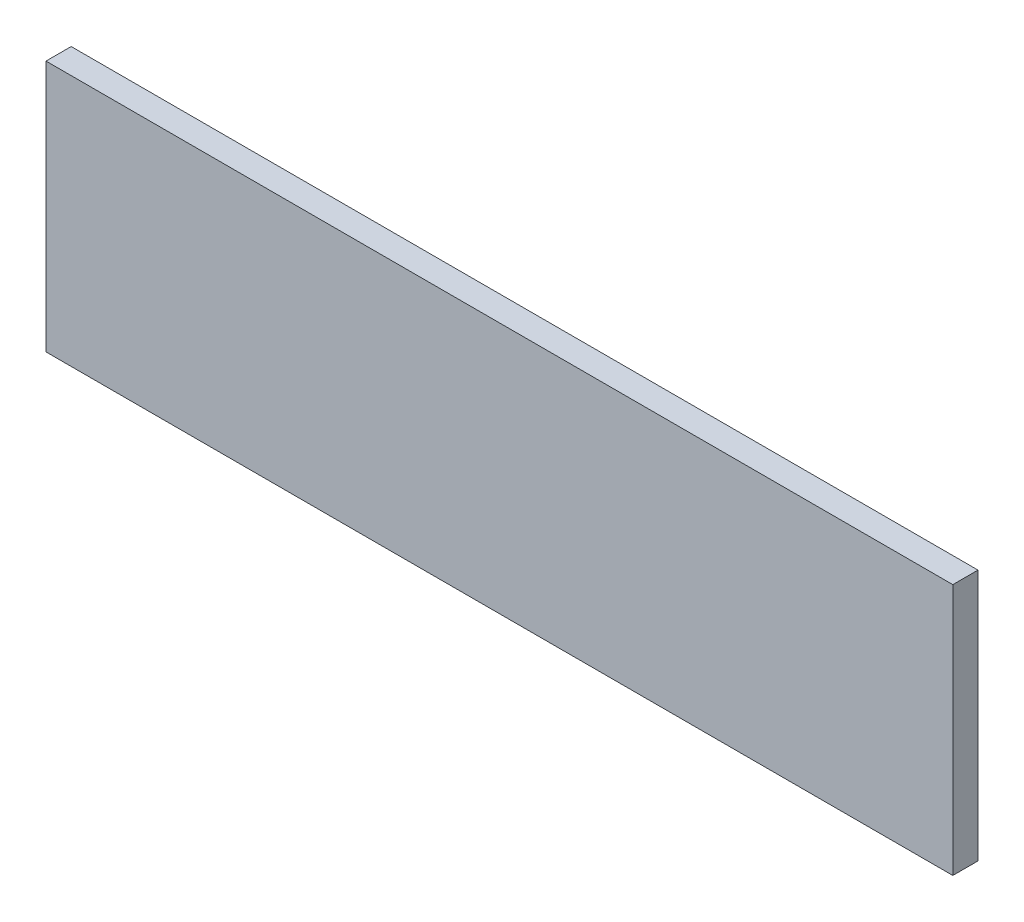
ISO-10303-21;
HEADER;
FILE_DESCRIPTION(('STEP AP214'),'2;1');
FILE_NAME('part.step','',(''),(''),'','','');
FILE_SCHEMA(('AUTOMOTIVE_DESIGN { 1 0 10303 214 1 1 1 1 }'));
ENDSEC;
DATA;
#1=APPLICATION_CONTEXT('core data for automotive mechanical design processes');
#2=APPLICATION_PROTOCOL_DEFINITION('international standard','automotive_design',2000,#1);
#3=PRODUCT_CONTEXT('',#1,'mechanical');
#4=PRODUCT('Part','Part','',(#3));
#5=PRODUCT_RELATED_PRODUCT_CATEGORY('part','',(#4));
#6=PRODUCT_DEFINITION_FORMATION('','',#4);
#7=PRODUCT_DEFINITION_CONTEXT('part definition',#1,'design');
#8=PRODUCT_DEFINITION('design','',#6,#7);
#9=PRODUCT_DEFINITION_SHAPE('','',#8);
#10=(LENGTH_UNIT() NAMED_UNIT(*) SI_UNIT(.MILLI.,.METRE.));
#11=(NAMED_UNIT(*) PLANE_ANGLE_UNIT() SI_UNIT($,.RADIAN.));
#12=(NAMED_UNIT(*) SI_UNIT($,.STERADIAN.) SOLID_ANGLE_UNIT());
#13=UNCERTAINTY_MEASURE_WITH_UNIT(LENGTH_MEASURE(1.E-05),#10,'distance_accuracy_value','');
#14=(GEOMETRIC_REPRESENTATION_CONTEXT(3) GLOBAL_UNCERTAINTY_ASSIGNED_CONTEXT((#13)) GLOBAL_UNIT_ASSIGNED_CONTEXT((#10,
#11,#12)) REPRESENTATION_CONTEXT('',''));
#15=CARTESIAN_POINT('',(0.,0.,0.));
#16=DIRECTION('',(0.,0.,1.));
#17=DIRECTION('',(1.,0.,0.));
#18=AXIS2_PLACEMENT_3D('',#15,#16,#17);
#19=CARTESIAN_POINT('',(-3.013229038242,-0.275,0.361799999973));
#20=DIRECTION('',(0.,0.,1.));
#21=DIRECTION('',(1.,0.,0.));
#22=AXIS2_PLACEMENT_3D('',#19,#20,#21);
#23=PLANE('',#22);
#24=DIRECTION('',(1.,0.,0.));
#25=VECTOR('',#24,1.);
#26=CARTESIAN_POINT('',(-3.013229038242,-0.275,0.361799999973));
#27=LINE('',#26,#25);
#28=CARTESIAN_POINT('',(-3.013229038242,-0.275,0.361799999973));
#29=VERTEX_POINT('',#28);
#30=CARTESIAN_POINT('',(0.586770961758,-0.275,0.361799999973));
#31=VERTEX_POINT('',#30);
#32=EDGE_CURVE('E42',#29,#31,#27,.T.);
#33=ORIENTED_EDGE('',*,*,#32,.T.);
#34=DIRECTION('',(0.,1.,0.));
#35=VECTOR('',#34,1.);
#36=CARTESIAN_POINT('',(0.586770961758,-0.275,0.361799999973));
#37=LINE('',#36,#35);
#38=CARTESIAN_POINT('',(0.586770961758,0.725,0.361799999973));
#39=VERTEX_POINT('',#38);
#40=EDGE_CURVE('E75',#31,#39,#37,.T.);
#41=ORIENTED_EDGE('',*,*,#40,.T.);
#42=DIRECTION('',(-1.,0.,0.));
#43=VECTOR('',#42,1.);
#44=CARTESIAN_POINT('',(0.586770961758,0.725,0.361799999973));
#45=LINE('',#44,#43);
#46=CARTESIAN_POINT('',(-3.013229038242,0.725,0.361799999973));
#47=VERTEX_POINT('',#46);
#48=EDGE_CURVE('E103',#39,#47,#45,.T.);
#49=ORIENTED_EDGE('',*,*,#48,.T.);
#50=DIRECTION('',(0.,-1.,0.));
#51=VECTOR('',#50,1.);
#52=CARTESIAN_POINT('',(-3.013229038242,0.725,0.361799999973));
#53=LINE('',#52,#51);
#54=EDGE_CURVE('E11',#47,#29,#53,.T.);
#55=ORIENTED_EDGE('',*,*,#54,.T.);
#56=EDGE_LOOP('',(#33,#41,#49,#55));
#57=FACE_BOUND('',#56,.T.);
#58=ADVANCED_FACE('F17',(#57),#23,.T.);
#59=CARTESIAN_POINT('',(-3.013229038242,0.725,0.361799999973));
#60=DIRECTION('',(1.,0.,0.));
#61=DIRECTION('',(0.,1.,0.));
#62=AXIS2_PLACEMENT_3D('',#59,#60,#61);
#63=PLANE('',#62);
#64=DIRECTION('',(0.,0.,1.));
#65=VECTOR('',#64,1.);
#66=CARTESIAN_POINT('',(-3.013229038242,-0.275,0.361799999973));
#67=LINE('',#66,#65);
#68=CARTESIAN_POINT('',(-3.013229038242,-0.275,0.261799999973));
#69=VERTEX_POINT('',#68);
#70=EDGE_CURVE('E25',#69,#29,#67,.T.);
#71=ORIENTED_EDGE('',*,*,#70,.T.);
#72=ORIENTED_EDGE('',*,*,#54,.F.);
#73=DIRECTION('',(0.,0.,-1.));
#74=VECTOR('',#73,1.);
#75=CARTESIAN_POINT('',(-3.013229038242,0.725,0.361799999973));
#76=LINE('',#75,#74);
#77=CARTESIAN_POINT('',(-3.013229038242,0.725,0.261799999973));
#78=VERTEX_POINT('',#77);
#79=EDGE_CURVE('E100',#47,#78,#76,.T.);
#80=ORIENTED_EDGE('',*,*,#79,.T.);
#81=DIRECTION('',(0.,-1.,0.));
#82=VECTOR('',#81,1.);
#83=CARTESIAN_POINT('',(-3.013229038242,-0.275,0.261799999973));
#84=LINE('',#83,#82);
#85=EDGE_CURVE('E86',#78,#69,#84,.T.);
#86=ORIENTED_EDGE('',*,*,#85,.T.);
#87=EDGE_LOOP('',(#71,#72,#80,#86));
#88=FACE_BOUND('',#87,.T.);
#89=ADVANCED_FACE('F115',(#88),#63,.F.);
#90=CARTESIAN_POINT('',(-3.013229038242,-0.275,0.361799999973));
#91=DIRECTION('',(0.,1.,0.));
#92=DIRECTION('',(1.,0.,0.));
#93=AXIS2_PLACEMENT_3D('',#90,#91,#92);
#94=PLANE('',#93);
#95=DIRECTION('',(0.,0.,1.));
#96=VECTOR('',#95,1.);
#97=CARTESIAN_POINT('',(0.586770961758,-0.275,0.361799999973));
#98=LINE('',#97,#96);
#99=CARTESIAN_POINT('',(0.586770961758,-0.275,0.261799999973));
#100=VERTEX_POINT('',#99);
#101=EDGE_CURVE('E69',#100,#31,#98,.T.);
#102=ORIENTED_EDGE('',*,*,#101,.T.);
#103=ORIENTED_EDGE('',*,*,#32,.F.);
#104=ORIENTED_EDGE('',*,*,#70,.F.);
#105=DIRECTION('',(1.,0.,0.));
#106=VECTOR('',#105,1.);
#107=CARTESIAN_POINT('',(-3.013229038242,-0.275,0.261799999973));
#108=LINE('',#107,#106);
#109=EDGE_CURVE('E80',#69,#100,#108,.T.);
#110=ORIENTED_EDGE('',*,*,#109,.T.);
#111=EDGE_LOOP('',(#102,#103,#104,#110));
#112=FACE_BOUND('',#111,.T.);
#113=ADVANCED_FACE('F81',(#112),#94,.F.);
#114=CARTESIAN_POINT('',(0.586770961758,-0.275,0.361799999973));
#115=DIRECTION('',(-1.,0.,0.));
#116=DIRECTION('',(0.,0.,1.));
#117=AXIS2_PLACEMENT_3D('',#114,#115,#116);
#118=PLANE('',#117);
#119=DIRECTION('',(0.,0.,1.));
#120=VECTOR('',#119,1.);
#121=CARTESIAN_POINT('',(0.586770961758,0.725,0.361799999973));
#122=LINE('',#121,#120);
#123=CARTESIAN_POINT('',(0.586770961758,0.725,0.261799999973));
#124=VERTEX_POINT('',#123);
#125=EDGE_CURVE('E106',#124,#39,#122,.T.);
#126=ORIENTED_EDGE('',*,*,#125,.T.);
#127=ORIENTED_EDGE('',*,*,#40,.F.);
#128=ORIENTED_EDGE('',*,*,#101,.F.);
#129=DIRECTION('',(0.,1.,0.));
#130=VECTOR('',#129,1.);
#131=CARTESIAN_POINT('',(0.586770961758,-0.275,0.261799999973));
#132=LINE('',#131,#130);
#133=EDGE_CURVE('E74',#100,#124,#132,.T.);
#134=ORIENTED_EDGE('',*,*,#133,.T.);
#135=EDGE_LOOP('',(#126,#127,#128,#134));
#136=FACE_BOUND('',#135,.T.);
#137=ADVANCED_FACE('F72',(#136),#118,.F.);
#138=CARTESIAN_POINT('',(0.586770961758,0.725,0.361799999973));
#139=DIRECTION('',(0.,-1.,0.));
#140=DIRECTION('',(0.,0.,-1.));
#141=AXIS2_PLACEMENT_3D('',#138,#139,#140);
#142=PLANE('',#141);
#143=ORIENTED_EDGE('',*,*,#79,.F.);
#144=ORIENTED_EDGE('',*,*,#48,.F.);
#145=ORIENTED_EDGE('',*,*,#125,.F.);
#146=DIRECTION('',(-1.,0.,0.));
#147=VECTOR('',#146,1.);
#148=CARTESIAN_POINT('',(-3.013229038242,0.725,0.261799999973));
#149=LINE('',#148,#147);
#150=EDGE_CURVE('E91',#124,#78,#149,.T.);
#151=ORIENTED_EDGE('',*,*,#150,.T.);
#152=EDGE_LOOP('',(#143,#144,#145,#151));
#153=FACE_BOUND('',#152,.T.);
#154=ADVANCED_FACE('F119',(#153),#142,.F.);
#155=CARTESIAN_POINT('',(-3.013229038242,-0.275,0.261799999973));
#156=DIRECTION('',(0.,0.,1.));
#157=DIRECTION('',(1.,0.,0.));
#158=AXIS2_PLACEMENT_3D('',#155,#156,#157);
#159=PLANE('',#158);
#160=ORIENTED_EDGE('',*,*,#133,.F.);
#161=ORIENTED_EDGE('',*,*,#109,.F.);
#162=ORIENTED_EDGE('',*,*,#85,.F.);
#163=ORIENTED_EDGE('',*,*,#150,.F.);
#164=EDGE_LOOP('',(#160,#161,#162,#163));
#165=FACE_BOUND('',#164,.T.);
#166=ADVANCED_FACE('F89',(#165),#159,.F.);
#167=CLOSED_SHELL('',(#58,#89,#113,#137,#154,#166));
#168=MANIFOLD_SOLID_BREP('B1',#167);
#169=ADVANCED_BREP_SHAPE_REPRESENTATION('',(#18,#168),#14);
#170=SHAPE_DEFINITION_REPRESENTATION(#9,#169);
ENDSEC;
END-ISO-10303-21;
